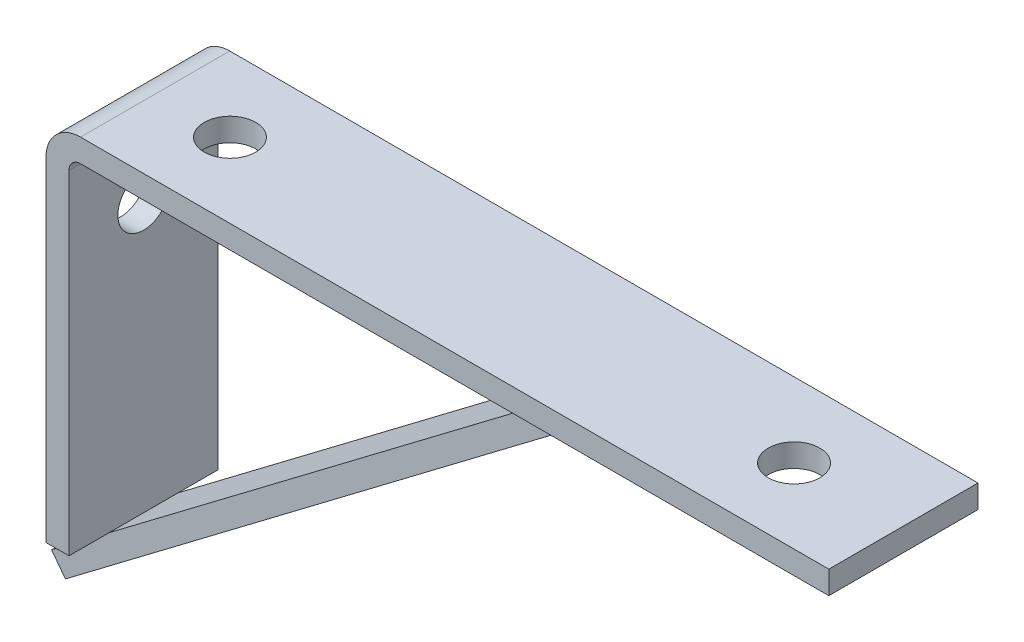
ISO-10303-21;
HEADER;
FILE_DESCRIPTION(('STEP AP214'),'2;1');
FILE_NAME('part.step','',(''),(''),'','','');
FILE_SCHEMA(('AUTOMOTIVE_DESIGN { 1 0 10303 214 1 1 1 1 }'));
ENDSEC;
DATA;
#1=APPLICATION_CONTEXT('core data for automotive mechanical design processes');
#2=APPLICATION_PROTOCOL_DEFINITION('international standard','automotive_design',2000,#1);
#3=PRODUCT_CONTEXT('',#1,'mechanical');
#4=PRODUCT('Part','Part','',(#3));
#5=PRODUCT_RELATED_PRODUCT_CATEGORY('part','',(#4));
#6=PRODUCT_DEFINITION_FORMATION('','',#4);
#7=PRODUCT_DEFINITION_CONTEXT('part definition',#1,'design');
#8=PRODUCT_DEFINITION('design','',#6,#7);
#9=PRODUCT_DEFINITION_SHAPE('','',#8);
#10=(LENGTH_UNIT() NAMED_UNIT(*) SI_UNIT(.MILLI.,.METRE.));
#11=(NAMED_UNIT(*) PLANE_ANGLE_UNIT() SI_UNIT($,.RADIAN.));
#12=(NAMED_UNIT(*) SI_UNIT($,.STERADIAN.) SOLID_ANGLE_UNIT());
#13=UNCERTAINTY_MEASURE_WITH_UNIT(LENGTH_MEASURE(1.E-05),#10,'distance_accuracy_value','');
#14=(GEOMETRIC_REPRESENTATION_CONTEXT(3) GLOBAL_UNCERTAINTY_ASSIGNED_CONTEXT((#13)) GLOBAL_UNIT_ASSIGNED_CONTEXT((#10,
#11,#12)) REPRESENTATION_CONTEXT('',''));
#15=CARTESIAN_POINT('',(0.,0.,0.));
#16=DIRECTION('',(0.,0.,1.));
#17=DIRECTION('',(1.,0.,0.));
#18=AXIS2_PLACEMENT_3D('',#15,#16,#17);
#19=CARTESIAN_POINT('',(-103.1875,-6.34999999999999,20.574));
#20=DIRECTION('',(0.,1.,0.));
#21=DIRECTION('',(-1.,0.,0.));
#22=AXIS2_PLACEMENT_3D('',#19,#20,#21);
#23=PLANE('',#22);
#24=CARTESIAN_POINT('',(73.025,-6.35,0.));
#25=DIRECTION('',(0.,1.,0.));
#26=DIRECTION('',(-1.,0.,0.));
#27=AXIS2_PLACEMENT_3D('',#24,#25,#26);
#28=CIRCLE('',#27,7.112);
#29=CARTESIAN_POINT('',(65.913,-6.35,0.));
#30=VERTEX_POINT('',#29);
#31=EDGE_CURVE('E334',#30,#30,#28,.T.);
#32=ORIENTED_EDGE('',*,*,#31,.T.);
#33=EDGE_LOOP('',(#32));
#34=FACE_BOUND('',#33,.T.);
#35=CARTESIAN_POINT('',(-82.55,-6.34999999999999,0.));
#36=DIRECTION('',(0.,1.,0.));
#37=DIRECTION('',(-1.,0.,0.));
#38=AXIS2_PLACEMENT_3D('',#35,#36,#37);
#39=CIRCLE('',#38,7.112);
#40=CARTESIAN_POINT('',(-89.662,-6.34999999999999,0.));
#41=VERTEX_POINT('',#40);
#42=EDGE_CURVE('E284',#41,#41,#39,.T.);
#43=ORIENTED_EDGE('',*,*,#42,.T.);
#44=EDGE_LOOP('',(#43));
#45=FACE_BOUND('',#44,.T.);
#46=DIRECTION('',(1.,0.,0.));
#47=VECTOR('',#46,1.);
#48=CARTESIAN_POINT('',(-103.1875,-6.34999999999999,-20.574));
#49=LINE('',#48,#47);
#50=CARTESIAN_POINT('',(-103.1875,-6.34999999999999,-20.574));
#51=VERTEX_POINT('',#50);
#52=CARTESIAN_POINT('',(103.1875,-6.35,-20.574));
#53=VERTEX_POINT('',#52);
#54=EDGE_CURVE('E164',#51,#53,#49,.T.);
#55=ORIENTED_EDGE('',*,*,#54,.T.);
#56=DIRECTION('',(0.,0.,-1.));
#57=VECTOR('',#56,1.);
#58=CARTESIAN_POINT('',(103.1875,-6.35,20.574));
#59=LINE('',#58,#57);
#60=CARTESIAN_POINT('',(103.1875,-6.35,20.574));
#61=VERTEX_POINT('',#60);
#62=EDGE_CURVE('E11',#61,#53,#59,.T.);
#63=ORIENTED_EDGE('',*,*,#62,.F.);
#64=DIRECTION('',(1.,0.,0.));
#65=VECTOR('',#64,1.);
#66=CARTESIAN_POINT('',(-103.1875,-6.34999999999999,20.574));
#67=LINE('',#66,#65);
#68=CARTESIAN_POINT('',(-103.1875,-6.34999999999999,20.574));
#69=VERTEX_POINT('',#68);
#70=EDGE_CURVE('E173',#69,#61,#67,.T.);
#71=ORIENTED_EDGE('',*,*,#70,.F.);
#72=DIRECTION('',(0.,0.,-1.));
#73=VECTOR('',#72,1.);
#74=CARTESIAN_POINT('',(-103.1875,-6.34999999999999,20.574));
#75=LINE('',#74,#73);
#76=EDGE_CURVE('E194',#69,#51,#75,.T.);
#77=ORIENTED_EDGE('',*,*,#76,.T.);
#78=EDGE_LOOP('',(#55,#63,#71,#77));
#79=FACE_BOUND('',#78,.T.);
#80=DIRECTION('',(-1.,0.,0.));
#81=VECTOR('',#80,1.);
#82=CARTESIAN_POINT('',(19.5676099659045,-6.34999999999999,9.525));
#83=LINE('',#82,#81);
#84=CARTESIAN_POINT('',(30.0939694919334,-6.34999999999999,9.525));
#85=VERTEX_POINT('',#84);
#86=CARTESIAN_POINT('',(19.5676099659045,-6.34999999999999,9.525));
#87=VERTEX_POINT('',#86);
#88=EDGE_CURVE('E150',#85,#87,#83,.T.);
#89=ORIENTED_EDGE('',*,*,#88,.F.);
#90=DIRECTION('',(0.,0.,-1.));
#91=VECTOR('',#90,1.);
#92=CARTESIAN_POINT('',(30.0939694919334,-6.34999999999999,9.525));
#93=LINE('',#92,#91);
#94=CARTESIAN_POINT('',(30.0939694919334,-6.34999999999999,-9.525));
#95=VERTEX_POINT('',#94);
#96=EDGE_CURVE('E281',#85,#95,#93,.T.);
#97=ORIENTED_EDGE('',*,*,#96,.T.);
#98=DIRECTION('',(-1.,0.,0.));
#99=VECTOR('',#98,1.);
#100=CARTESIAN_POINT('',(19.5676099659045,-6.34999999999999,-9.525));
#101=LINE('',#100,#99);
#102=CARTESIAN_POINT('',(19.5676099659045,-6.34999999999999,-9.525));
#103=VERTEX_POINT('',#102);
#104=EDGE_CURVE('E163',#95,#103,#101,.T.);
#105=ORIENTED_EDGE('',*,*,#104,.T.);
#106=DIRECTION('',(0.,0.,-1.));
#107=VECTOR('',#106,1.);
#108=CARTESIAN_POINT('',(19.5676099659045,-6.34999999999999,9.525));
#109=LINE('',#108,#107);
#110=EDGE_CURVE('E53',#87,#103,#109,.T.);
#111=ORIENTED_EDGE('',*,*,#110,.F.);
#112=EDGE_LOOP('',(#89,#97,#105,#111));
#113=FACE_BOUND('',#112,.T.);
#114=ADVANCED_FACE('F39',(#34,#45,#79,#113),#23,.F.);
#115=CARTESIAN_POINT('',(-106.3625,-101.6,20.574));
#116=DIRECTION('',(0.,-1.,0.));
#117=DIRECTION('',(0.,0.,-1.));
#118=AXIS2_PLACEMENT_3D('',#115,#116,#117);
#119=PLANE('',#118);
#120=DIRECTION('',(0.,0.,-1.));
#121=VECTOR('',#120,1.);
#122=CARTESIAN_POINT('',(-112.7125,-101.6,20.574));
#123=LINE('',#122,#121);
#124=CARTESIAN_POINT('',(-112.7125,-101.6,20.574));
#125=VERTEX_POINT('',#124);
#126=CARTESIAN_POINT('',(-112.7125,-101.6,9.525));
#127=VERTEX_POINT('',#126);
#128=EDGE_CURVE('E223',#125,#127,#123,.T.);
#129=ORIENTED_EDGE('',*,*,#128,.T.);
#130=DIRECTION('',(-1.,0.,0.));
#131=VECTOR('',#130,1.);
#132=CARTESIAN_POINT('',(-106.3625,-101.6,9.525));
#133=LINE('',#132,#131);
#134=CARTESIAN_POINT('',(-106.3625,-101.6,9.525));
#135=VERTEX_POINT('',#134);
#136=EDGE_CURVE('E149',#135,#127,#133,.T.);
#137=ORIENTED_EDGE('',*,*,#136,.F.);
#138=DIRECTION('',(0.,0.,-1.));
#139=VECTOR('',#138,1.);
#140=CARTESIAN_POINT('',(-106.3625,-101.6,20.574));
#141=LINE('',#140,#139);
#142=CARTESIAN_POINT('',(-106.3625,-101.6,20.574));
#143=VERTEX_POINT('',#142);
#144=EDGE_CURVE('E219',#143,#135,#141,.T.);
#145=ORIENTED_EDGE('',*,*,#144,.F.);
#146=DIRECTION('',(-1.,0.,0.));
#147=VECTOR('',#146,1.);
#148=CARTESIAN_POINT('',(-106.3625,-101.6,20.574));
#149=LINE('',#148,#147);
#150=EDGE_CURVE('E188',#143,#125,#149,.T.);
#151=ORIENTED_EDGE('',*,*,#150,.T.);
#152=EDGE_LOOP('',(#129,#137,#145,#151));
#153=FACE_BOUND('',#152,.T.);
#154=ADVANCED_FACE('F271',(#153),#119,.T.);
#155=CARTESIAN_POINT('',(103.1875,0.,20.574));
#156=DIRECTION('',(1.,0.,0.));
#157=DIRECTION('',(0.,0.,-1.));
#158=AXIS2_PLACEMENT_3D('',#155,#156,#157);
#159=PLANE('',#158);
#160=DIRECTION('',(0.,-1.,0.));
#161=VECTOR('',#160,1.);
#162=CARTESIAN_POINT('',(103.1875,0.,-20.574));
#163=LINE('',#162,#161);
#164=CARTESIAN_POINT('',(103.1875,0.,-20.574));
#165=VERTEX_POINT('',#164);
#166=EDGE_CURVE('E167',#165,#53,#163,.T.);
#167=ORIENTED_EDGE('',*,*,#166,.F.);
#168=DIRECTION('',(0.,0.,-1.));
#169=VECTOR('',#168,1.);
#170=CARTESIAN_POINT('',(103.1875,0.,20.574));
#171=LINE('',#170,#169);
#172=CARTESIAN_POINT('',(103.1875,0.,20.574));
#173=VERTEX_POINT('',#172);
#174=EDGE_CURVE('E46',#173,#165,#171,.T.);
#175=ORIENTED_EDGE('',*,*,#174,.F.);
#176=DIRECTION('',(0.,-1.,0.));
#177=VECTOR('',#176,1.);
#178=CARTESIAN_POINT('',(103.1875,0.,20.574));
#179=LINE('',#178,#177);
#180=EDGE_CURVE('E175',#173,#61,#179,.T.);
#181=ORIENTED_EDGE('',*,*,#180,.T.);
#182=ORIENTED_EDGE('',*,*,#62,.T.);
#183=EDGE_LOOP('',(#167,#175,#181,#182));
#184=FACE_BOUND('',#183,.T.);
#185=ADVANCED_FACE('F236',(#184),#159,.T.);
#186=CARTESIAN_POINT('',(-103.1875,0.,20.574));
#187=DIRECTION('',(0.,1.,0.));
#188=DIRECTION('',(-1.,0.,0.));
#189=AXIS2_PLACEMENT_3D('',#186,#187,#188);
#190=PLANE('',#189);
#191=CARTESIAN_POINT('',(73.025,0.,0.));
#192=DIRECTION('',(0.,1.,0.));
#193=DIRECTION('',(-1.,0.,0.));
#194=AXIS2_PLACEMENT_3D('',#191,#192,#193);
#195=CIRCLE('',#194,7.112);
#196=CARTESIAN_POINT('',(65.913,0.,0.));
#197=VERTEX_POINT('',#196);
#198=EDGE_CURVE('E343',#197,#197,#195,.T.);
#199=ORIENTED_EDGE('',*,*,#198,.F.);
#200=EDGE_LOOP('',(#199));
#201=FACE_BOUND('',#200,.T.);
#202=CARTESIAN_POINT('',(-82.55,0.,0.));
#203=DIRECTION('',(0.,1.,0.));
#204=DIRECTION('',(-1.,0.,0.));
#205=AXIS2_PLACEMENT_3D('',#202,#203,#204);
#206=CIRCLE('',#205,7.112);
#207=CARTESIAN_POINT('',(-89.662,0.,0.));
#208=VERTEX_POINT('',#207);
#209=EDGE_CURVE('E338',#208,#208,#206,.T.);
#210=ORIENTED_EDGE('',*,*,#209,.F.);
#211=EDGE_LOOP('',(#210));
#212=FACE_BOUND('',#211,.T.);
#213=DIRECTION('',(1.,0.,0.));
#214=VECTOR('',#213,1.);
#215=CARTESIAN_POINT('',(-103.1875,0.,-20.574));
#216=LINE('',#215,#214);
#217=CARTESIAN_POINT('',(-103.1875,0.,-20.574));
#218=VERTEX_POINT('',#217);
#219=EDGE_CURVE('E198',#218,#165,#216,.T.);
#220=ORIENTED_EDGE('',*,*,#219,.F.);
#221=DIRECTION('',(0.,0.,-1.));
#222=VECTOR('',#221,1.);
#223=CARTESIAN_POINT('',(-103.1875,0.,20.574));
#224=LINE('',#223,#222);
#225=CARTESIAN_POINT('',(-103.1875,0.,20.574));
#226=VERTEX_POINT('',#225);
#227=EDGE_CURVE('E228',#226,#218,#224,.T.);
#228=ORIENTED_EDGE('',*,*,#227,.F.);
#229=DIRECTION('',(1.,0.,0.));
#230=VECTOR('',#229,1.);
#231=CARTESIAN_POINT('',(-103.1875,0.,20.574));
#232=LINE('',#231,#230);
#233=EDGE_CURVE('E179',#226,#173,#232,.T.);
#234=ORIENTED_EDGE('',*,*,#233,.T.);
#235=ORIENTED_EDGE('',*,*,#174,.T.);
#236=EDGE_LOOP('',(#220,#228,#234,#235));
#237=FACE_BOUND('',#236,.T.);
#238=ADVANCED_FACE('F232',(#201,#212,#237),#190,.T.);
#239=CARTESIAN_POINT('',(-103.1875,-9.525,20.574));
#240=DIRECTION('',(0.,0.,-1.));
#241=DIRECTION('',(-1.,0.,0.));
#242=AXIS2_PLACEMENT_3D('',#239,#240,#241);
#243=CYLINDRICAL_SURFACE('',#242,9.52500000000001);
#244=CARTESIAN_POINT('',(-103.1875,-9.525,-20.574));
#245=DIRECTION('',(0.,0.,-1.));
#246=DIRECTION('',(-1.,0.,0.));
#247=AXIS2_PLACEMENT_3D('',#244,#245,#246);
#248=CIRCLE('',#247,9.52500000000001);
#249=CARTESIAN_POINT('',(-112.7125,-9.525,-20.574));
#250=VERTEX_POINT('',#249);
#251=EDGE_CURVE('E201',#250,#218,#248,.T.);
#252=ORIENTED_EDGE('',*,*,#251,.F.);
#253=DIRECTION('',(0.,0.,-1.));
#254=VECTOR('',#253,1.);
#255=CARTESIAN_POINT('',(-112.7125,-9.525,20.574));
#256=LINE('',#255,#254);
#257=CARTESIAN_POINT('',(-112.7125,-9.525,20.574));
#258=VERTEX_POINT('',#257);
#259=EDGE_CURVE('E226',#258,#250,#256,.T.);
#260=ORIENTED_EDGE('',*,*,#259,.F.);
#261=CARTESIAN_POINT('',(-103.1875,-9.525,20.574));
#262=DIRECTION('',(0.,0.,-1.));
#263=DIRECTION('',(-1.,0.,0.));
#264=AXIS2_PLACEMENT_3D('',#261,#262,#263);
#265=CIRCLE('',#264,9.52500000000001);
#266=EDGE_CURVE('E182',#258,#226,#265,.T.);
#267=ORIENTED_EDGE('',*,*,#266,.T.);
#268=ORIENTED_EDGE('',*,*,#227,.T.);
#269=EDGE_LOOP('',(#252,#260,#267,#268));
#270=FACE_BOUND('',#269,.T.);
#271=ADVANCED_FACE('F244',(#270),#243,.T.);
#272=CARTESIAN_POINT('',(-112.7125,-101.6,20.574));
#273=DIRECTION('',(-1.,0.,0.));
#274=DIRECTION('',(0.,0.,1.));
#275=AXIS2_PLACEMENT_3D('',#272,#273,#274);
#276=PLANE('',#275);
#277=CARTESIAN_POINT('',(-112.7125,-26.9875,0.));
#278=DIRECTION('',(-1.,0.,0.));
#279=DIRECTION('',(0.,0.,1.));
#280=AXIS2_PLACEMENT_3D('',#277,#278,#279);
#281=CIRCLE('',#280,7.112);
#282=CARTESIAN_POINT('',(-112.7125,-26.9875,7.112));
#283=VERTEX_POINT('',#282);
#284=EDGE_CURVE('E348',#283,#283,#281,.T.);
#285=ORIENTED_EDGE('',*,*,#284,.F.);
#286=EDGE_LOOP('',(#285));
#287=FACE_BOUND('',#286,.T.);
#288=DIRECTION('',(0.,1.,0.));
#289=VECTOR('',#288,1.);
#290=CARTESIAN_POINT('',(-112.7125,-101.6,-20.574));
#291=LINE('',#290,#289);
#292=CARTESIAN_POINT('',(-112.7125,-101.6,-20.574));
#293=VERTEX_POINT('',#292);
#294=EDGE_CURVE('E204',#293,#250,#291,.T.);
#295=ORIENTED_EDGE('',*,*,#294,.F.);
#296=CARTESIAN_POINT('',(-112.7125,-101.6,-9.525));
#297=VERTEX_POINT('',#296);
#298=EDGE_CURVE('E222',#297,#293,#123,.T.);
#299=ORIENTED_EDGE('',*,*,#298,.F.);
#300=DIRECTION('',(0.,-1.,0.));
#301=VECTOR('',#300,1.);
#302=CARTESIAN_POINT('',(-112.7125,-101.6,-9.525));
#303=LINE('',#302,#301);
#304=CARTESIAN_POINT('',(-112.7125,-106.402961739363,-9.525));
#305=VERTEX_POINT('',#304);
#306=EDGE_CURVE('E287',#297,#305,#303,.T.);
#307=ORIENTED_EDGE('',*,*,#306,.T.);
#308=DIRECTION('',(0.,0.,-1.));
#309=VECTOR('',#308,1.);
#310=CARTESIAN_POINT('',(-112.7125,-106.402961739363,9.525));
#311=LINE('',#310,#309);
#312=CARTESIAN_POINT('',(-112.7125,-106.402961739363,9.525));
#313=VERTEX_POINT('',#312);
#314=EDGE_CURVE('E169',#313,#305,#311,.T.);
#315=ORIENTED_EDGE('',*,*,#314,.F.);
#316=DIRECTION('',(0.,-1.,0.));
#317=VECTOR('',#316,1.);
#318=CARTESIAN_POINT('',(-112.7125,-101.6,9.525));
#319=LINE('',#318,#317);
#320=EDGE_CURVE('E272',#127,#313,#319,.T.);
#321=ORIENTED_EDGE('',*,*,#320,.F.);
#322=ORIENTED_EDGE('',*,*,#128,.F.);
#323=DIRECTION('',(0.,1.,0.));
#324=VECTOR('',#323,1.);
#325=CARTESIAN_POINT('',(-112.7125,-101.6,20.574));
#326=LINE('',#325,#324);
#327=EDGE_CURVE('E185',#125,#258,#326,.T.);
#328=ORIENTED_EDGE('',*,*,#327,.T.);
#329=ORIENTED_EDGE('',*,*,#259,.T.);
#330=EDGE_LOOP('',(#295,#299,#307,#315,#321,#322,#328,#329));
#331=FACE_BOUND('',#330,.T.);
#332=ADVANCED_FACE('F268',(#287,#331),#276,.T.);
#333=DIRECTION('',(-1.,0.,0.));
#334=VECTOR('',#333,1.);
#335=CARTESIAN_POINT('',(-106.3625,-101.6,-9.525));
#336=LINE('',#335,#334);
#337=CARTESIAN_POINT('',(-106.3625,-101.6,-9.525));
#338=VERTEX_POINT('',#337);
#339=EDGE_CURVE('E60',#338,#297,#336,.T.);
#340=ORIENTED_EDGE('',*,*,#339,.T.);
#341=ORIENTED_EDGE('',*,*,#298,.T.);
#342=DIRECTION('',(-1.,0.,0.));
#343=VECTOR('',#342,1.);
#344=CARTESIAN_POINT('',(-106.3625,-101.6,-20.574));
#345=LINE('',#344,#343);
#346=CARTESIAN_POINT('',(-106.3625,-101.6,-20.574));
#347=VERTEX_POINT('',#346);
#348=EDGE_CURVE('E207',#347,#293,#345,.T.);
#349=ORIENTED_EDGE('',*,*,#348,.F.);
#350=EDGE_CURVE('E218',#338,#347,#141,.T.);
#351=ORIENTED_EDGE('',*,*,#350,.F.);
#352=EDGE_LOOP('',(#340,#341,#349,#351));
#353=FACE_BOUND('',#352,.T.);
#354=ADVANCED_FACE('F265',(#353),#119,.T.);
#355=CARTESIAN_POINT('',(-106.3625,-101.6,20.574));
#356=DIRECTION('',(-1.,0.,0.));
#357=DIRECTION('',(0.,0.,1.));
#358=AXIS2_PLACEMENT_3D('',#355,#356,#357);
#359=PLANE('',#358);
#360=CARTESIAN_POINT('',(-106.3625,-26.9875,0.));
#361=DIRECTION('',(-1.,0.,0.));
#362=DIRECTION('',(0.,0.,1.));
#363=AXIS2_PLACEMENT_3D('',#360,#361,#362);
#364=CIRCLE('',#363,7.112);
#365=CARTESIAN_POINT('',(-106.3625,-26.9875,7.112));
#366=VERTEX_POINT('',#365);
#367=EDGE_CURVE('E346',#366,#366,#364,.T.);
#368=ORIENTED_EDGE('',*,*,#367,.T.);
#369=EDGE_LOOP('',(#368));
#370=FACE_BOUND('',#369,.T.);
#371=DIRECTION('',(0.,1.,0.));
#372=VECTOR('',#371,1.);
#373=CARTESIAN_POINT('',(-106.3625,-101.6,-20.574));
#374=LINE('',#373,#372);
#375=CARTESIAN_POINT('',(-106.3625,-9.525,-20.574));
#376=VERTEX_POINT('',#375);
#377=EDGE_CURVE('E210',#347,#376,#374,.T.);
#378=ORIENTED_EDGE('',*,*,#377,.T.);
#379=DIRECTION('',(0.,0.,-1.));
#380=VECTOR('',#379,1.);
#381=CARTESIAN_POINT('',(-106.3625,-9.525,20.574));
#382=LINE('',#381,#380);
#383=CARTESIAN_POINT('',(-106.3625,-9.525,20.574));
#384=VERTEX_POINT('',#383);
#385=EDGE_CURVE('E215',#384,#376,#382,.T.);
#386=ORIENTED_EDGE('',*,*,#385,.F.);
#387=DIRECTION('',(0.,1.,0.));
#388=VECTOR('',#387,1.);
#389=CARTESIAN_POINT('',(-106.3625,-101.6,20.574));
#390=LINE('',#389,#388);
#391=EDGE_CURVE('E191',#143,#384,#390,.T.);
#392=ORIENTED_EDGE('',*,*,#391,.F.);
#393=ORIENTED_EDGE('',*,*,#144,.T.);
#394=DIRECTION('',(0.,0.,-1.));
#395=VECTOR('',#394,1.);
#396=CARTESIAN_POINT('',(-106.3625,-101.6,9.525));
#397=LINE('',#396,#395);
#398=EDGE_CURVE('E146',#135,#338,#397,.T.);
#399=ORIENTED_EDGE('',*,*,#398,.T.);
#400=ORIENTED_EDGE('',*,*,#350,.T.);
#401=EDGE_LOOP('',(#378,#386,#392,#393,#399,#400));
#402=FACE_BOUND('',#401,.T.);
#403=ADVANCED_FACE('F261',(#370,#402),#359,.F.);
#404=CARTESIAN_POINT('',(-103.1875,-9.525,20.574));
#405=DIRECTION('',(0.,0.,-1.));
#406=DIRECTION('',(-1.,0.,0.));
#407=AXIS2_PLACEMENT_3D('',#404,#405,#406);
#408=CYLINDRICAL_SURFACE('',#407,3.17500000000001);
#409=CARTESIAN_POINT('',(-103.1875,-9.525,-20.574));
#410=DIRECTION('',(0.,0.,1.));
#411=DIRECTION('',(1.,0.,0.));
#412=AXIS2_PLACEMENT_3D('',#409,#410,#411);
#413=CIRCLE('',#412,3.17500000000001);
#414=EDGE_CURVE('E176',#376,#51,#413,.F.);
#415=ORIENTED_EDGE('',*,*,#414,.T.);
#416=ORIENTED_EDGE('',*,*,#76,.F.);
#417=CARTESIAN_POINT('',(-103.1875,-9.525,20.574));
#418=DIRECTION('',(0.,0.,1.));
#419=DIRECTION('',(1.,0.,0.));
#420=AXIS2_PLACEMENT_3D('',#417,#418,#419);
#421=CIRCLE('',#420,3.17500000000001);
#422=EDGE_CURVE('E193',#384,#69,#421,.F.);
#423=ORIENTED_EDGE('',*,*,#422,.F.);
#424=ORIENTED_EDGE('',*,*,#385,.T.);
#425=EDGE_LOOP('',(#415,#416,#423,#424));
#426=FACE_BOUND('',#425,.T.);
#427=ADVANCED_FACE('F257',(#426),#408,.F.);
#428=CARTESIAN_POINT('',(-103.1875,-9.525,20.574));
#429=DIRECTION('',(0.,0.,-1.));
#430=DIRECTION('',(-1.,0.,0.));
#431=AXIS2_PLACEMENT_3D('',#428,#429,#430);
#432=PLANE('',#431);
#433=ORIENTED_EDGE('',*,*,#70,.T.);
#434=ORIENTED_EDGE('',*,*,#180,.F.);
#435=ORIENTED_EDGE('',*,*,#233,.F.);
#436=ORIENTED_EDGE('',*,*,#266,.F.);
#437=ORIENTED_EDGE('',*,*,#327,.F.);
#438=ORIENTED_EDGE('',*,*,#150,.F.);
#439=ORIENTED_EDGE('',*,*,#391,.T.);
#440=ORIENTED_EDGE('',*,*,#422,.T.);
#441=EDGE_LOOP('',(#433,#434,#435,#436,#437,#438,#439,#440));
#442=FACE_BOUND('',#441,.T.);
#443=ADVANCED_FACE('F247',(#442),#432,.F.);
#444=CARTESIAN_POINT('',(-103.1875,-9.525,-20.574));
#445=DIRECTION('',(0.,0.,-1.));
#446=DIRECTION('',(-1.,0.,0.));
#447=AXIS2_PLACEMENT_3D('',#444,#445,#446);
#448=PLANE('',#447);
#449=ORIENTED_EDGE('',*,*,#54,.F.);
#450=ORIENTED_EDGE('',*,*,#414,.F.);
#451=ORIENTED_EDGE('',*,*,#377,.F.);
#452=ORIENTED_EDGE('',*,*,#348,.T.);
#453=ORIENTED_EDGE('',*,*,#294,.T.);
#454=ORIENTED_EDGE('',*,*,#251,.T.);
#455=ORIENTED_EDGE('',*,*,#219,.T.);
#456=ORIENTED_EDGE('',*,*,#166,.T.);
#457=EDGE_LOOP('',(#449,#450,#451,#452,#453,#454,#455,#456));
#458=FACE_BOUND('',#457,.T.);
#459=ADVANCED_FACE('F240',(#458),#448,.T.);
#460=CARTESIAN_POINT('',(19.5676099659045,-6.34999999999999,9.525));
#461=DIRECTION('',(0.6032474935231,-0.79755404930205,0.));
#462=DIRECTION('',(0.79755404930205,0.6032474935231,0.));
#463=AXIS2_PLACEMENT_3D('',#460,#461,#462);
#464=PLANE('',#463);
#465=DIRECTION('',(-0.79755404930205,-0.6032474935231,0.));
#466=VECTOR('',#465,1.);
#467=CARTESIAN_POINT('',(19.5676099659045,-6.34999999999999,-9.525));
#468=LINE('',#467,#466);
#469=EDGE_CURVE('E283',#103,#338,#468,.T.);
#470=ORIENTED_EDGE('',*,*,#469,.T.);
#471=ORIENTED_EDGE('',*,*,#398,.F.);
#472=DIRECTION('',(-0.79755404930205,-0.6032474935231,0.));
#473=VECTOR('',#472,1.);
#474=CARTESIAN_POINT('',(19.5676099659045,-6.34999999999999,9.525));
#475=LINE('',#474,#473);
#476=EDGE_CURVE('E142',#87,#135,#475,.T.);
#477=ORIENTED_EDGE('',*,*,#476,.F.);
#478=ORIENTED_EDGE('',*,*,#110,.T.);
#479=EDGE_LOOP('',(#470,#471,#477,#478));
#480=FACE_BOUND('',#479,.T.);
#481=ADVANCED_FACE('F144',(#480),#464,.F.);
#482=CARTESIAN_POINT('',(-112.7125,-106.402961739363,9.525));
#483=DIRECTION('',(0.603247493523101,-0.79755404930205,0.));
#484=DIRECTION('',(0.79755404930205,0.603247493523101,0.));
#485=AXIS2_PLACEMENT_3D('',#482,#483,#484);
#486=PLANE('',#485);
#487=DIRECTION('',(-0.79755404930205,-0.603247493523101,0.));
#488=VECTOR('',#487,1.);
#489=CARTESIAN_POINT('',(-112.7125,-106.402961739363,-9.525));
#490=LINE('',#489,#488);
#491=CARTESIAN_POINT('',(-122.2375,-113.607404348407,-9.525));
#492=VERTEX_POINT('',#491);
#493=EDGE_CURVE('E289',#305,#492,#490,.T.);
#494=ORIENTED_EDGE('',*,*,#493,.T.);
#495=DIRECTION('',(0.,0.,-1.));
#496=VECTOR('',#495,1.);
#497=CARTESIAN_POINT('',(-122.2375,-113.607404348407,9.525));
#498=LINE('',#497,#496);
#499=CARTESIAN_POINT('',(-122.2375,-113.607404348407,9.525));
#500=VERTEX_POINT('',#499);
#501=EDGE_CURVE('E298',#500,#492,#498,.T.);
#502=ORIENTED_EDGE('',*,*,#501,.F.);
#503=DIRECTION('',(-0.79755404930205,-0.603247493523101,0.));
#504=VECTOR('',#503,1.);
#505=CARTESIAN_POINT('',(-112.7125,-106.402961739363,9.525));
#506=LINE('',#505,#504);
#507=EDGE_CURVE('E274',#313,#500,#506,.T.);
#508=ORIENTED_EDGE('',*,*,#507,.F.);
#509=ORIENTED_EDGE('',*,*,#314,.T.);
#510=EDGE_LOOP('',(#494,#502,#508,#509));
#511=FACE_BOUND('',#510,.T.);
#512=ADVANCED_FACE('F305',(#511),#486,.F.);
#513=CARTESIAN_POINT('',(-122.2375,-113.607404348407,9.525));
#514=DIRECTION('',(0.79755404930205,0.6032474935231,0.));
#515=DIRECTION('',(-0.6032474935231,0.79755404930205,0.));
#516=AXIS2_PLACEMENT_3D('',#513,#514,#515);
#517=PLANE('',#516);
#518=DIRECTION('',(0.6032474935231,-0.79755404930205,0.));
#519=VECTOR('',#518,1.);
#520=CARTESIAN_POINT('',(-122.2375,-113.607404348407,-9.525));
#521=LINE('',#520,#519);
#522=CARTESIAN_POINT('',(-118.406878416128,-118.671872561475,-9.525));
#523=VERTEX_POINT('',#522);
#524=EDGE_CURVE('E291',#492,#523,#521,.T.);
#525=ORIENTED_EDGE('',*,*,#524,.T.);
#526=DIRECTION('',(0.,0.,-1.));
#527=VECTOR('',#526,1.);
#528=CARTESIAN_POINT('',(-118.406878416128,-118.671872561475,9.525));
#529=LINE('',#528,#527);
#530=CARTESIAN_POINT('',(-118.406878416128,-118.671872561475,9.525));
#531=VERTEX_POINT('',#530);
#532=EDGE_CURVE('E295',#531,#523,#529,.T.);
#533=ORIENTED_EDGE('',*,*,#532,.F.);
#534=DIRECTION('',(0.6032474935231,-0.79755404930205,0.));
#535=VECTOR('',#534,1.);
#536=CARTESIAN_POINT('',(-122.2375,-113.607404348407,9.525));
#537=LINE('',#536,#535);
#538=EDGE_CURVE('E278',#500,#531,#537,.T.);
#539=ORIENTED_EDGE('',*,*,#538,.F.);
#540=ORIENTED_EDGE('',*,*,#501,.T.);
#541=EDGE_LOOP('',(#525,#533,#539,#540));
#542=FACE_BOUND('',#541,.T.);
#543=ADVANCED_FACE('F312',(#542),#517,.F.);
#544=CARTESIAN_POINT('',(-118.406878416128,-118.671872561475,9.525));
#545=DIRECTION('',(-0.603247493523101,0.79755404930205,0.));
#546=DIRECTION('',(-0.79755404930205,-0.603247493523101,0.));
#547=AXIS2_PLACEMENT_3D('',#544,#545,#546);
#548=PLANE('',#547);
#549=DIRECTION('',(0.79755404930205,0.6032474935231,0.));
#550=VECTOR('',#549,1.);
#551=CARTESIAN_POINT('',(-118.406878416128,-118.671872561475,-9.525));
#552=LINE('',#551,#550);
#553=EDGE_CURVE('E159',#523,#95,#552,.T.);
#554=ORIENTED_EDGE('',*,*,#553,.T.);
#555=ORIENTED_EDGE('',*,*,#96,.F.);
#556=DIRECTION('',(0.79755404930205,0.6032474935231,0.));
#557=VECTOR('',#556,1.);
#558=CARTESIAN_POINT('',(-118.406878416128,-118.671872561475,9.525));
#559=LINE('',#558,#557);
#560=EDGE_CURVE('E155',#531,#85,#559,.T.);
#561=ORIENTED_EDGE('',*,*,#560,.F.);
#562=ORIENTED_EDGE('',*,*,#532,.T.);
#563=EDGE_LOOP('',(#554,#555,#561,#562));
#564=FACE_BOUND('',#563,.T.);
#565=ADVANCED_FACE('F315',(#564),#548,.F.);
#566=CARTESIAN_POINT('',(-112.7125,-6.34999999999994,9.525));
#567=DIRECTION('',(0.,0.,-1.));
#568=DIRECTION('',(-1.,0.,0.));
#569=AXIS2_PLACEMENT_3D('',#566,#567,#568);
#570=PLANE('',#569);
#571=ORIENTED_EDGE('',*,*,#88,.T.);
#572=ORIENTED_EDGE('',*,*,#476,.T.);
#573=ORIENTED_EDGE('',*,*,#136,.T.);
#574=ORIENTED_EDGE('',*,*,#320,.T.);
#575=ORIENTED_EDGE('',*,*,#507,.T.);
#576=ORIENTED_EDGE('',*,*,#538,.T.);
#577=ORIENTED_EDGE('',*,*,#560,.T.);
#578=EDGE_LOOP('',(#571,#572,#573,#574,#575,#576,#577));
#579=FACE_BOUND('',#578,.T.);
#580=ADVANCED_FACE('F153',(#579),#570,.F.);
#581=CARTESIAN_POINT('',(-112.7125,-6.34999999999994,-9.525));
#582=DIRECTION('',(0.,0.,-1.));
#583=DIRECTION('',(-1.,0.,0.));
#584=AXIS2_PLACEMENT_3D('',#581,#582,#583);
#585=PLANE('',#584);
#586=ORIENTED_EDGE('',*,*,#104,.F.);
#587=ORIENTED_EDGE('',*,*,#553,.F.);
#588=ORIENTED_EDGE('',*,*,#524,.F.);
#589=ORIENTED_EDGE('',*,*,#493,.F.);
#590=ORIENTED_EDGE('',*,*,#306,.F.);
#591=ORIENTED_EDGE('',*,*,#339,.F.);
#592=ORIENTED_EDGE('',*,*,#469,.F.);
#593=EDGE_LOOP('',(#586,#587,#588,#589,#590,#591,#592));
#594=FACE_BOUND('',#593,.T.);
#595=ADVANCED_FACE('F308',(#594),#585,.T.);
#596=CARTESIAN_POINT('',(-82.55,-6.34999999999999,0.));
#597=DIRECTION('',(0.,1.,0.));
#598=DIRECTION('',(-1.,0.,0.));
#599=AXIS2_PLACEMENT_3D('',#596,#597,#598);
#600=CYLINDRICAL_SURFACE('',#599,7.112);
#601=ORIENTED_EDGE('',*,*,#42,.F.);
#602=EDGE_LOOP('',(#601));
#603=FACE_BOUND('',#602,.T.);
#604=ORIENTED_EDGE('',*,*,#209,.T.);
#605=EDGE_LOOP('',(#604));
#606=FACE_BOUND('',#605,.T.);
#607=ADVANCED_FACE('F466',(#603,#606),#600,.F.);
#608=CARTESIAN_POINT('',(73.025,-6.35,0.));
#609=DIRECTION('',(0.,1.,0.));
#610=DIRECTION('',(-1.,0.,0.));
#611=AXIS2_PLACEMENT_3D('',#608,#609,#610);
#612=CYLINDRICAL_SURFACE('',#611,7.112);
#613=ORIENTED_EDGE('',*,*,#31,.F.);
#614=EDGE_LOOP('',(#613));
#615=FACE_BOUND('',#614,.T.);
#616=ORIENTED_EDGE('',*,*,#198,.T.);
#617=EDGE_LOOP('',(#616));
#618=FACE_BOUND('',#617,.T.);
#619=ADVANCED_FACE('F358',(#615,#618),#612,.F.);
#620=CARTESIAN_POINT('',(-106.3625,-26.9875,0.));
#621=DIRECTION('',(-1.,0.,0.));
#622=DIRECTION('',(0.,0.,1.));
#623=AXIS2_PLACEMENT_3D('',#620,#621,#622);
#624=CYLINDRICAL_SURFACE('',#623,7.112);
#625=ORIENTED_EDGE('',*,*,#367,.F.);
#626=EDGE_LOOP('',(#625));
#627=FACE_BOUND('',#626,.T.);
#628=ORIENTED_EDGE('',*,*,#284,.T.);
#629=EDGE_LOOP('',(#628));
#630=FACE_BOUND('',#629,.T.);
#631=ADVANCED_FACE('F355',(#627,#630),#624,.F.);
#632=CLOSED_SHELL('',(#114,#154,#185,#238,#271,#332,#354,#403,#427,#443,#459,#481,#512,#543,
#565,#580,#595,#607,#619,#631));
#633=MANIFOLD_SOLID_BREP('B2',#632);
#634=ADVANCED_BREP_SHAPE_REPRESENTATION('',(#18,#633),#14);
#635=SHAPE_DEFINITION_REPRESENTATION(#9,#634);
ENDSEC;
END-ISO-10303-21;
